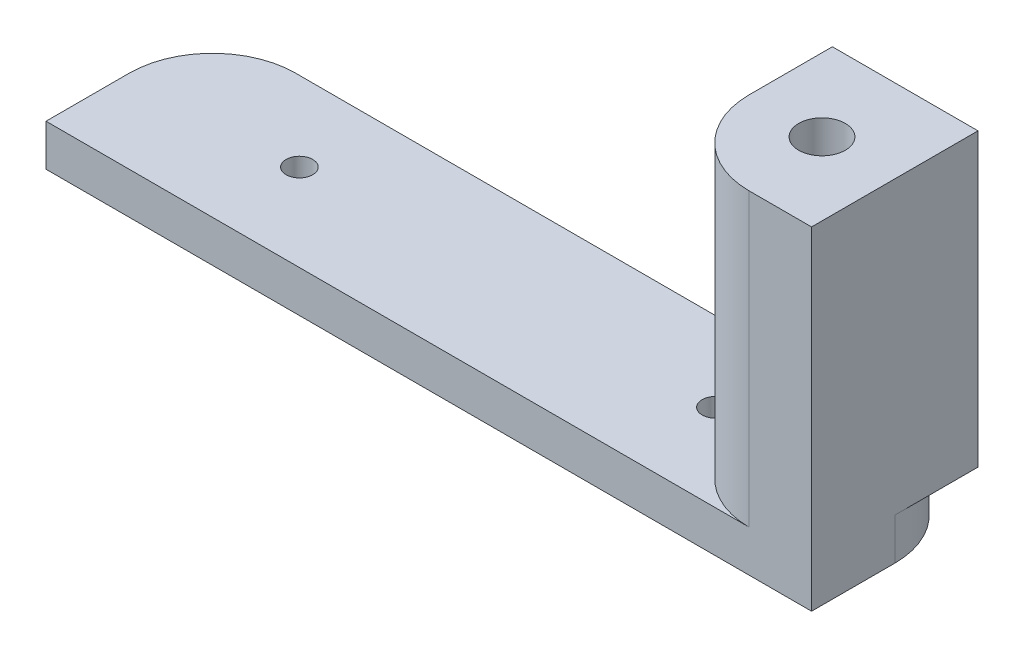
ISO-10303-21;
HEADER;
FILE_DESCRIPTION(('STEP AP214'),'2;1');
FILE_NAME('part.step','',(''),(''),'','','');
FILE_SCHEMA(('AUTOMOTIVE_DESIGN { 1 0 10303 214 1 1 1 1 }'));
ENDSEC;
DATA;
#1=APPLICATION_CONTEXT('core data for automotive mechanical design processes');
#2=APPLICATION_PROTOCOL_DEFINITION('international standard','automotive_design',2000,#1);
#3=PRODUCT_CONTEXT('',#1,'mechanical');
#4=PRODUCT('Part','Part','',(#3));
#5=PRODUCT_RELATED_PRODUCT_CATEGORY('part','',(#4));
#6=PRODUCT_DEFINITION_FORMATION('','',#4);
#7=PRODUCT_DEFINITION_CONTEXT('part definition',#1,'design');
#8=PRODUCT_DEFINITION('design','',#6,#7);
#9=PRODUCT_DEFINITION_SHAPE('','',#8);
#10=(LENGTH_UNIT() NAMED_UNIT(*) SI_UNIT(.MILLI.,.METRE.));
#11=(NAMED_UNIT(*) PLANE_ANGLE_UNIT() SI_UNIT($,.RADIAN.));
#12=(NAMED_UNIT(*) SI_UNIT($,.STERADIAN.) SOLID_ANGLE_UNIT());
#13=UNCERTAINTY_MEASURE_WITH_UNIT(LENGTH_MEASURE(1.E-05),#10,'distance_accuracy_value','');
#14=(GEOMETRIC_REPRESENTATION_CONTEXT(3) GLOBAL_UNCERTAINTY_ASSIGNED_CONTEXT((#13)) GLOBAL_UNIT_ASSIGNED_CONTEXT((#10,
#11,#12)) REPRESENTATION_CONTEXT('',''));
#15=CARTESIAN_POINT('',(0.,0.,0.));
#16=DIRECTION('',(0.,0.,1.));
#17=DIRECTION('',(1.,0.,0.));
#18=AXIS2_PLACEMENT_3D('',#15,#16,#17);
#19=CARTESIAN_POINT('',(0.,5.,0.));
#20=DIRECTION('',(0.,-1.,0.));
#21=DIRECTION('',(0.,0.,-1.));
#22=AXIS2_PLACEMENT_3D('',#19,#20,#21);
#23=PLANE('',#22);
#24=CARTESIAN_POINT('',(24.,5.,-0.449999999999999));
#25=DIRECTION('',(0.,1.,0.));
#26=DIRECTION('',(0.,0.,1.));
#27=AXIS2_PLACEMENT_3D('',#24,#25,#26);
#28=CIRCLE('',#27,1.6);
#29=CARTESIAN_POINT('',(24.,5.,1.15));
#30=VERTEX_POINT('',#29);
#31=EDGE_CURVE('E185',#30,#30,#28,.T.);
#32=ORIENTED_EDGE('',*,*,#31,.F.);
#33=EDGE_LOOP('',(#32));
#34=FACE_BOUND('',#33,.T.);
#35=CARTESIAN_POINT('',(-26.,5.,-0.449999999999999));
#36=DIRECTION('',(0.,1.,0.));
#37=DIRECTION('',(0.,0.,1.));
#38=AXIS2_PLACEMENT_3D('',#35,#36,#37);
#39=CIRCLE('',#38,1.6);
#40=CARTESIAN_POINT('',(-26.,5.,1.15));
#41=VERTEX_POINT('',#40);
#42=EDGE_CURVE('E181',#41,#41,#39,.T.);
#43=ORIENTED_EDGE('',*,*,#42,.F.);
#44=EDGE_LOOP('',(#43));
#45=FACE_BOUND('',#44,.T.);
#46=DIRECTION('',(0.,0.,1.));
#47=VECTOR('',#46,1.);
#48=CARTESIAN_POINT('',(28.5,5.,-10.));
#49=LINE('',#48,#47);
#50=CARTESIAN_POINT('',(28.5,5.,-10.));
#51=VERTEX_POINT('',#50);
#52=CARTESIAN_POINT('',(28.5,5.,0.));
#53=VERTEX_POINT('',#52);
#54=EDGE_CURVE('E159',#51,#53,#49,.T.);
#55=ORIENTED_EDGE('',*,*,#54,.F.);
#56=DIRECTION('',(-1.,0.,0.));
#57=VECTOR('',#56,1.);
#58=CARTESIAN_POINT('',(-46.,5.,-10.));
#59=LINE('',#58,#57);
#60=CARTESIAN_POINT('',(-36.,5.,-10.));
#61=VERTEX_POINT('',#60);
#62=EDGE_CURVE('E192',#51,#61,#59,.T.);
#63=ORIENTED_EDGE('',*,*,#62,.T.);
#64=CARTESIAN_POINT('',(-36.,5.,0.));
#65=DIRECTION('',(0.,-1.,0.));
#66=DIRECTION('',(0.,0.,-1.));
#67=AXIS2_PLACEMENT_3D('',#64,#65,#66);
#68=CIRCLE('',#67,10.);
#69=CARTESIAN_POINT('',(-46.,5.,0.));
#70=VERTEX_POINT('',#69);
#71=EDGE_CURVE('E230',#61,#70,#68,.F.);
#72=ORIENTED_EDGE('',*,*,#71,.T.);
#73=DIRECTION('',(0.,0.,1.));
#74=VECTOR('',#73,1.);
#75=CARTESIAN_POINT('',(-46.,5.,10.));
#76=LINE('',#75,#74);
#77=CARTESIAN_POINT('',(-46.,5.,10.));
#78=VERTEX_POINT('',#77);
#79=EDGE_CURVE('E195',#70,#78,#76,.T.);
#80=ORIENTED_EDGE('',*,*,#79,.T.);
#81=DIRECTION('',(1.,0.,0.));
#82=VECTOR('',#81,1.);
#83=CARTESIAN_POINT('',(-46.,5.,10.));
#84=LINE('',#83,#82);
#85=CARTESIAN_POINT('',(38.5,5.,10.));
#86=VERTEX_POINT('',#85);
#87=EDGE_CURVE('E145',#78,#86,#84,.T.);
#88=ORIENTED_EDGE('',*,*,#87,.T.);
#89=CARTESIAN_POINT('',(38.5,5.,0.));
#90=DIRECTION('',(0.,-1.,0.));
#91=DIRECTION('',(0.,0.,-1.));
#92=AXIS2_PLACEMENT_3D('',#89,#90,#91);
#93=CIRCLE('',#92,10.);
#94=EDGE_CURVE('E11',#86,#53,#93,.T.);
#95=ORIENTED_EDGE('',*,*,#94,.T.);
#96=EDGE_LOOP('',(#55,#63,#72,#80,#88,#95));
#97=FACE_BOUND('',#96,.T.);
#98=ADVANCED_FACE('F45',(#34,#45,#97),#23,.F.);
#99=CARTESIAN_POINT('',(46.,5.,10.));
#100=DIRECTION('',(-1.,0.,0.));
#101=DIRECTION('',(0.,0.,1.));
#102=AXIS2_PLACEMENT_3D('',#99,#100,#101);
#103=PLANE('',#102);
#104=DIRECTION('',(0.,0.,-1.));
#105=VECTOR('',#104,1.);
#106=CARTESIAN_POINT('',(46.,0.,10.));
#107=LINE('',#106,#105);
#108=CARTESIAN_POINT('',(46.,0.,10.));
#109=VERTEX_POINT('',#108);
#110=CARTESIAN_POINT('',(46.,0.,0.));
#111=VERTEX_POINT('',#110);
#112=EDGE_CURVE('E180',#109,#111,#107,.T.);
#113=ORIENTED_EDGE('',*,*,#112,.T.);
#114=DIRECTION('',(0.,-1.,0.));
#115=VECTOR('',#114,1.);
#116=CARTESIAN_POINT('',(46.,5.,0.));
#117=LINE('',#116,#115);
#118=CARTESIAN_POINT('',(46.,5.,0.));
#119=VERTEX_POINT('',#118);
#120=EDGE_CURVE('E227',#111,#119,#117,.F.);
#121=ORIENTED_EDGE('',*,*,#120,.T.);
#122=DIRECTION('',(0.,0.,-1.));
#123=VECTOR('',#122,1.);
#124=CARTESIAN_POINT('',(46.,5.,-10.));
#125=LINE('',#124,#123);
#126=CARTESIAN_POINT('',(46.,5.,-10.));
#127=VERTEX_POINT('',#126);
#128=EDGE_CURVE('E162',#119,#127,#125,.T.);
#129=ORIENTED_EDGE('',*,*,#128,.T.);
#130=DIRECTION('',(0.,-1.,0.));
#131=VECTOR('',#130,1.);
#132=CARTESIAN_POINT('',(46.,40.,-10.));
#133=LINE('',#132,#131);
#134=CARTESIAN_POINT('',(46.,40.,-10.));
#135=VERTEX_POINT('',#134);
#136=EDGE_CURVE('E149',#135,#127,#133,.T.);
#137=ORIENTED_EDGE('',*,*,#136,.F.);
#138=DIRECTION('',(0.,0.,-1.));
#139=VECTOR('',#138,1.);
#140=CARTESIAN_POINT('',(46.,40.,-10.));
#141=LINE('',#140,#139);
#142=CARTESIAN_POINT('',(46.,40.,10.));
#143=VERTEX_POINT('',#142);
#144=EDGE_CURVE('E125',#143,#135,#141,.T.);
#145=ORIENTED_EDGE('',*,*,#144,.F.);
#146=DIRECTION('',(0.,-1.,0.));
#147=VECTOR('',#146,1.);
#148=CARTESIAN_POINT('',(46.,5.,10.));
#149=LINE('',#148,#147);
#150=EDGE_CURVE('E135',#143,#109,#149,.T.);
#151=ORIENTED_EDGE('',*,*,#150,.T.);
#152=EDGE_LOOP('',(#113,#121,#129,#137,#145,#151));
#153=FACE_BOUND('',#152,.T.);
#154=ADVANCED_FACE('F147',(#153),#103,.F.);
#155=CARTESIAN_POINT('',(-46.,5.,-10.));
#156=DIRECTION('',(0.,0.,1.));
#157=DIRECTION('',(1.,0.,0.));
#158=AXIS2_PLACEMENT_3D('',#155,#156,#157);
#159=PLANE('',#158);
#160=ORIENTED_EDGE('',*,*,#62,.F.);
#161=DIRECTION('',(0.,-1.,0.));
#162=VECTOR('',#161,1.);
#163=CARTESIAN_POINT('',(28.5,40.,-10.));
#164=LINE('',#163,#162);
#165=CARTESIAN_POINT('',(28.5,40.,-10.));
#166=VERTEX_POINT('',#165);
#167=EDGE_CURVE('E155',#166,#51,#164,.T.);
#168=ORIENTED_EDGE('',*,*,#167,.F.);
#169=DIRECTION('',(-1.,0.,0.));
#170=VECTOR('',#169,1.);
#171=CARTESIAN_POINT('',(28.5,40.,-10.));
#172=LINE('',#171,#170);
#173=EDGE_CURVE('E152',#135,#166,#172,.T.);
#174=ORIENTED_EDGE('',*,*,#173,.F.);
#175=ORIENTED_EDGE('',*,*,#136,.T.);
#176=DIRECTION('',(-1.,0.,0.));
#177=VECTOR('',#176,1.);
#178=CARTESIAN_POINT('',(28.5,5.,-10.));
#179=LINE('',#178,#177);
#180=CARTESIAN_POINT('',(36.,5.,-10.));
#181=VERTEX_POINT('',#180);
#182=EDGE_CURVE('E166',#127,#181,#179,.T.);
#183=ORIENTED_EDGE('',*,*,#182,.T.);
#184=DIRECTION('',(0.,-1.,0.));
#185=VECTOR('',#184,1.);
#186=CARTESIAN_POINT('',(36.,5.,-10.));
#187=LINE('',#186,#185);
#188=CARTESIAN_POINT('',(36.,0.,-10.));
#189=VERTEX_POINT('',#188);
#190=EDGE_CURVE('E217',#181,#189,#187,.T.);
#191=ORIENTED_EDGE('',*,*,#190,.T.);
#192=DIRECTION('',(-1.,0.,0.));
#193=VECTOR('',#192,1.);
#194=CARTESIAN_POINT('',(-46.,0.,-10.));
#195=LINE('',#194,#193);
#196=CARTESIAN_POINT('',(-36.,0.,-10.));
#197=VERTEX_POINT('',#196);
#198=EDGE_CURVE('E202',#189,#197,#195,.T.);
#199=ORIENTED_EDGE('',*,*,#198,.T.);
#200=DIRECTION('',(0.,-1.,0.));
#201=VECTOR('',#200,1.);
#202=CARTESIAN_POINT('',(-36.,5.,-10.));
#203=LINE('',#202,#201);
#204=EDGE_CURVE('E213',#197,#61,#203,.F.);
#205=ORIENTED_EDGE('',*,*,#204,.T.);
#206=EDGE_LOOP('',(#160,#168,#174,#175,#183,#191,#199,#205));
#207=FACE_BOUND('',#206,.T.);
#208=ADVANCED_FACE('F263',(#207),#159,.F.);
#209=CARTESIAN_POINT('',(-46.,5.,10.));
#210=DIRECTION('',(1.,0.,0.));
#211=DIRECTION('',(0.,0.,-1.));
#212=AXIS2_PLACEMENT_3D('',#209,#210,#211);
#213=PLANE('',#212);
#214=ORIENTED_EDGE('',*,*,#79,.F.);
#215=DIRECTION('',(0.,-1.,0.));
#216=VECTOR('',#215,1.);
#217=CARTESIAN_POINT('',(-46.,5.,0.));
#218=LINE('',#217,#216);
#219=CARTESIAN_POINT('',(-46.,0.,0.));
#220=VERTEX_POINT('',#219);
#221=EDGE_CURVE('E237',#70,#220,#218,.T.);
#222=ORIENTED_EDGE('',*,*,#221,.T.);
#223=DIRECTION('',(0.,0.,1.));
#224=VECTOR('',#223,1.);
#225=CARTESIAN_POINT('',(-46.,0.,10.));
#226=LINE('',#225,#224);
#227=CARTESIAN_POINT('',(-46.,0.,10.));
#228=VERTEX_POINT('',#227);
#229=EDGE_CURVE('E206',#220,#228,#226,.T.);
#230=ORIENTED_EDGE('',*,*,#229,.T.);
#231=DIRECTION('',(0.,-1.,0.));
#232=VECTOR('',#231,1.);
#233=CARTESIAN_POINT('',(-46.,5.,10.));
#234=LINE('',#233,#232);
#235=EDGE_CURVE('E144',#78,#228,#234,.T.);
#236=ORIENTED_EDGE('',*,*,#235,.F.);
#237=EDGE_LOOP('',(#214,#222,#230,#236));
#238=FACE_BOUND('',#237,.T.);
#239=ADVANCED_FACE('F277',(#238),#213,.F.);
#240=CARTESIAN_POINT('',(-46.,5.,10.));
#241=DIRECTION('',(0.,0.,-1.));
#242=DIRECTION('',(-1.,0.,0.));
#243=AXIS2_PLACEMENT_3D('',#240,#241,#242);
#244=PLANE('',#243);
#245=DIRECTION('',(1.,0.,0.));
#246=VECTOR('',#245,1.);
#247=CARTESIAN_POINT('',(28.5,40.,10.));
#248=LINE('',#247,#246);
#249=CARTESIAN_POINT('',(38.5,40.,10.));
#250=VERTEX_POINT('',#249);
#251=EDGE_CURVE('E121',#250,#143,#248,.T.);
#252=ORIENTED_EDGE('',*,*,#251,.F.);
#253=DIRECTION('',(0.,-1.,0.));
#254=VECTOR('',#253,1.);
#255=CARTESIAN_POINT('',(38.5,5.,10.));
#256=LINE('',#255,#254);
#257=EDGE_CURVE('E241',#250,#86,#256,.T.);
#258=ORIENTED_EDGE('',*,*,#257,.T.);
#259=ORIENTED_EDGE('',*,*,#87,.F.);
#260=ORIENTED_EDGE('',*,*,#235,.T.);
#261=DIRECTION('',(1.,0.,0.));
#262=VECTOR('',#261,1.);
#263=CARTESIAN_POINT('',(-46.,0.,10.));
#264=LINE('',#263,#262);
#265=EDGE_CURVE('E139',#228,#109,#264,.T.);
#266=ORIENTED_EDGE('',*,*,#265,.T.);
#267=ORIENTED_EDGE('',*,*,#150,.F.);
#268=EDGE_LOOP('',(#252,#258,#259,#260,#266,#267));
#269=FACE_BOUND('',#268,.T.);
#270=ADVANCED_FACE('F136',(#269),#244,.F.);
#271=CARTESIAN_POINT('',(0.,0.,0.));
#272=DIRECTION('',(0.,-1.,0.));
#273=DIRECTION('',(0.,0.,-1.));
#274=AXIS2_PLACEMENT_3D('',#271,#272,#273);
#275=PLANE('',#274);
#276=CARTESIAN_POINT('',(37.25,0.,0.));
#277=DIRECTION('',(0.,-1.,0.));
#278=DIRECTION('',(0.,0.,-1.));
#279=AXIS2_PLACEMENT_3D('',#276,#277,#278);
#280=CIRCLE('',#279,2.8);
#281=CARTESIAN_POINT('',(37.25,0.,2.8));
#282=VERTEX_POINT('',#281);
#283=EDGE_CURVE('E163',#282,#282,#280,.T.);
#284=ORIENTED_EDGE('',*,*,#283,.F.);
#285=EDGE_LOOP('',(#284));
#286=FACE_BOUND('',#285,.T.);
#287=CARTESIAN_POINT('',(-26.,0.,-0.449999999999999));
#288=DIRECTION('',(0.,1.,0.));
#289=DIRECTION('',(0.,0.,1.));
#290=AXIS2_PLACEMENT_3D('',#287,#288,#289);
#291=CIRCLE('',#290,1.6);
#292=CARTESIAN_POINT('',(-26.,0.,1.15));
#293=VERTEX_POINT('',#292);
#294=EDGE_CURVE('E176',#293,#293,#291,.T.);
#295=ORIENTED_EDGE('',*,*,#294,.T.);
#296=EDGE_LOOP('',(#295));
#297=FACE_BOUND('',#296,.T.);
#298=CARTESIAN_POINT('',(24.,0.,-0.449999999999999));
#299=DIRECTION('',(0.,1.,0.));
#300=DIRECTION('',(0.,0.,1.));
#301=AXIS2_PLACEMENT_3D('',#298,#299,#300);
#302=CIRCLE('',#301,1.6);
#303=CARTESIAN_POINT('',(24.,0.,1.15));
#304=VERTEX_POINT('',#303);
#305=EDGE_CURVE('E175',#304,#304,#302,.T.);
#306=ORIENTED_EDGE('',*,*,#305,.T.);
#307=EDGE_LOOP('',(#306));
#308=FACE_BOUND('',#307,.T.);
#309=ORIENTED_EDGE('',*,*,#198,.F.);
#310=CARTESIAN_POINT('',(36.,0.,0.));
#311=DIRECTION('',(0.,-1.,0.));
#312=DIRECTION('',(0.,0.,-1.));
#313=AXIS2_PLACEMENT_3D('',#310,#311,#312);
#314=CIRCLE('',#313,10.);
#315=EDGE_CURVE('E224',#189,#111,#314,.T.);
#316=ORIENTED_EDGE('',*,*,#315,.T.);
#317=ORIENTED_EDGE('',*,*,#112,.F.);
#318=ORIENTED_EDGE('',*,*,#265,.F.);
#319=ORIENTED_EDGE('',*,*,#229,.F.);
#320=CARTESIAN_POINT('',(-36.,0.,0.));
#321=DIRECTION('',(0.,-1.,0.));
#322=DIRECTION('',(0.,0.,-1.));
#323=AXIS2_PLACEMENT_3D('',#320,#321,#322);
#324=CIRCLE('',#323,10.);
#325=EDGE_CURVE('E221',#220,#197,#324,.T.);
#326=ORIENTED_EDGE('',*,*,#325,.T.);
#327=EDGE_LOOP('',(#309,#316,#317,#318,#319,#326));
#328=FACE_BOUND('',#327,.T.);
#329=ADVANCED_FACE('F271',(#286,#297,#308,#328),#275,.T.);
#330=CARTESIAN_POINT('',(36.,5.,0.));
#331=DIRECTION('',(0.,-1.,0.));
#332=DIRECTION('',(0.,0.,-1.));
#333=AXIS2_PLACEMENT_3D('',#330,#331,#332);
#334=CYLINDRICAL_SURFACE('',#333,10.);
#335=CARTESIAN_POINT('',(36.,5.,0.));
#336=DIRECTION('',(0.,-1.,0.));
#337=DIRECTION('',(0.,0.,-1.));
#338=AXIS2_PLACEMENT_3D('',#335,#336,#337);
#339=CIRCLE('',#338,10.);
#340=EDGE_CURVE('E233',#119,#181,#339,.F.);
#341=ORIENTED_EDGE('',*,*,#340,.F.);
#342=ORIENTED_EDGE('',*,*,#120,.F.);
#343=ORIENTED_EDGE('',*,*,#315,.F.);
#344=ORIENTED_EDGE('',*,*,#190,.F.);
#345=EDGE_LOOP('',(#341,#342,#343,#344));
#346=FACE_BOUND('',#345,.T.);
#347=ADVANCED_FACE('F274',(#346),#334,.T.);
#348=CARTESIAN_POINT('',(-36.,5.,0.));
#349=DIRECTION('',(0.,-1.,0.));
#350=DIRECTION('',(0.,0.,-1.));
#351=AXIS2_PLACEMENT_3D('',#348,#349,#350);
#352=CYLINDRICAL_SURFACE('',#351,10.);
#353=ORIENTED_EDGE('',*,*,#71,.F.);
#354=ORIENTED_EDGE('',*,*,#204,.F.);
#355=ORIENTED_EDGE('',*,*,#325,.F.);
#356=ORIENTED_EDGE('',*,*,#221,.F.);
#357=EDGE_LOOP('',(#353,#354,#355,#356));
#358=FACE_BOUND('',#357,.T.);
#359=ADVANCED_FACE('F285',(#358),#352,.T.);
#360=CARTESIAN_POINT('',(24.,0.,-0.449999999999999));
#361=DIRECTION('',(0.,1.,0.));
#362=DIRECTION('',(0.,0.,1.));
#363=AXIS2_PLACEMENT_3D('',#360,#361,#362);
#364=CYLINDRICAL_SURFACE('',#363,1.6);
#365=ORIENTED_EDGE('',*,*,#305,.F.);
#366=EDGE_LOOP('',(#365));
#367=FACE_BOUND('',#366,.T.);
#368=ORIENTED_EDGE('',*,*,#31,.T.);
#369=EDGE_LOOP('',(#368));
#370=FACE_BOUND('',#369,.T.);
#371=ADVANCED_FACE('F269',(#367,#370),#364,.F.);
#372=CARTESIAN_POINT('',(-26.,0.,-0.449999999999999));
#373=DIRECTION('',(0.,1.,0.));
#374=DIRECTION('',(0.,0.,1.));
#375=AXIS2_PLACEMENT_3D('',#372,#373,#374);
#376=CYLINDRICAL_SURFACE('',#375,1.6);
#377=ORIENTED_EDGE('',*,*,#294,.F.);
#378=EDGE_LOOP('',(#377));
#379=FACE_BOUND('',#378,.T.);
#380=ORIENTED_EDGE('',*,*,#42,.T.);
#381=EDGE_LOOP('',(#380));
#382=FACE_BOUND('',#381,.T.);
#383=ADVANCED_FACE('F292',(#379,#382),#376,.F.);
#384=CARTESIAN_POINT('',(0.,5.,0.));
#385=DIRECTION('',(0.,1.,0.));
#386=DIRECTION('',(0.,0.,1.));
#387=AXIS2_PLACEMENT_3D('',#384,#385,#386);
#388=PLANE('',#387);
#389=ORIENTED_EDGE('',*,*,#128,.F.);
#390=ORIENTED_EDGE('',*,*,#340,.T.);
#391=ORIENTED_EDGE('',*,*,#182,.F.);
#392=EDGE_LOOP('',(#389,#390,#391));
#393=FACE_BOUND('',#392,.T.);
#394=ADVANCED_FACE('F308',(#393),#388,.F.);
#395=CARTESIAN_POINT('',(28.5,40.,-10.));
#396=DIRECTION('',(1.,0.,0.));
#397=DIRECTION('',(0.,0.,-1.));
#398=AXIS2_PLACEMENT_3D('',#395,#396,#397);
#399=PLANE('',#398);
#400=ORIENTED_EDGE('',*,*,#54,.T.);
#401=DIRECTION('',(0.,-1.,0.));
#402=VECTOR('',#401,1.);
#403=CARTESIAN_POINT('',(28.5,40.,0.));
#404=LINE('',#403,#402);
#405=CARTESIAN_POINT('',(28.5,40.,0.));
#406=VERTEX_POINT('',#405);
#407=EDGE_CURVE('E61',#53,#406,#404,.F.);
#408=ORIENTED_EDGE('',*,*,#407,.T.);
#409=DIRECTION('',(0.,0.,1.));
#410=VECTOR('',#409,1.);
#411=CARTESIAN_POINT('',(28.5,40.,-10.));
#412=LINE('',#411,#410);
#413=EDGE_CURVE('E132',#166,#406,#412,.T.);
#414=ORIENTED_EDGE('',*,*,#413,.F.);
#415=ORIENTED_EDGE('',*,*,#167,.T.);
#416=EDGE_LOOP('',(#400,#408,#414,#415));
#417=FACE_BOUND('',#416,.T.);
#418=ADVANCED_FACE('F321',(#417),#399,.F.);
#419=CARTESIAN_POINT('',(0.,40.,0.));
#420=DIRECTION('',(0.,1.,0.));
#421=DIRECTION('',(0.,0.,1.));
#422=AXIS2_PLACEMENT_3D('',#419,#420,#421);
#423=PLANE('',#422);
#424=CARTESIAN_POINT('',(37.25,40.,0.));
#425=DIRECTION('',(0.,1.,0.));
#426=DIRECTION('',(0.,0.,1.));
#427=AXIS2_PLACEMENT_3D('',#424,#425,#426);
#428=CIRCLE('',#427,2.8);
#429=CARTESIAN_POINT('',(37.25,40.,2.8));
#430=VERTEX_POINT('',#429);
#431=EDGE_CURVE('E315',#430,#430,#428,.T.);
#432=ORIENTED_EDGE('',*,*,#431,.F.);
#433=EDGE_LOOP('',(#432));
#434=FACE_BOUND('',#433,.T.);
#435=ORIENTED_EDGE('',*,*,#413,.T.);
#436=CARTESIAN_POINT('',(38.5,40.,0.));
#437=DIRECTION('',(0.,1.,0.));
#438=DIRECTION('',(0.,0.,1.));
#439=AXIS2_PLACEMENT_3D('',#436,#437,#438);
#440=CIRCLE('',#439,10.);
#441=EDGE_CURVE('E54',#406,#250,#440,.T.);
#442=ORIENTED_EDGE('',*,*,#441,.T.);
#443=ORIENTED_EDGE('',*,*,#251,.T.);
#444=ORIENTED_EDGE('',*,*,#144,.T.);
#445=ORIENTED_EDGE('',*,*,#173,.T.);
#446=EDGE_LOOP('',(#435,#442,#443,#444,#445));
#447=FACE_BOUND('',#446,.T.);
#448=ADVANCED_FACE('F123',(#434,#447),#423,.T.);
#449=CARTESIAN_POINT('',(37.25,-5.,0.));
#450=DIRECTION('',(0.,1.,0.));
#451=DIRECTION('',(0.,0.,1.));
#452=AXIS2_PLACEMENT_3D('',#449,#450,#451);
#453=CYLINDRICAL_SURFACE('',#452,2.8);
#454=CARTESIAN_POINT('',(37.25,0.,2.8));
#455=CARTESIAN_POINT('',(37.25,0.416666666666668,2.8));
#456=CARTESIAN_POINT('',(37.25,0.833333333333334,2.8));
#457=CARTESIAN_POINT('',(37.25,1.66666666666667,2.8));
#458=CARTESIAN_POINT('',(37.25,2.08333333333333,2.8));
#459=CARTESIAN_POINT('',(37.25,2.91666666666667,2.8));
#460=CARTESIAN_POINT('',(37.25,3.33333333333333,2.8));
#461=CARTESIAN_POINT('',(37.25,4.16666666666667,2.8));
#462=CARTESIAN_POINT('',(37.25,4.58333333333333,2.8));
#463=CARTESIAN_POINT('',(37.25,5.41666666666667,2.8));
#464=CARTESIAN_POINT('',(37.25,5.83333333333333,2.8));
#465=CARTESIAN_POINT('',(37.25,6.66666666666667,2.8));
#466=CARTESIAN_POINT('',(37.25,7.08333333333333,2.8));
#467=CARTESIAN_POINT('',(37.25,7.91666666666667,2.8));
#468=CARTESIAN_POINT('',(37.25,8.33333333333334,2.8));
#469=CARTESIAN_POINT('',(37.25,9.16666666666667,2.8));
#470=CARTESIAN_POINT('',(37.25,9.58333333333333,2.8));
#471=CARTESIAN_POINT('',(37.25,10.4166666666667,2.8));
#472=CARTESIAN_POINT('',(37.25,10.8333333333333,2.8));
#473=CARTESIAN_POINT('',(37.25,11.6666666666667,2.8));
#474=CARTESIAN_POINT('',(37.25,12.0833333333333,2.8));
#475=CARTESIAN_POINT('',(37.25,12.9166666666667,2.8));
#476=CARTESIAN_POINT('',(37.25,13.3333333333333,2.8));
#477=CARTESIAN_POINT('',(37.25,14.1666666666667,2.8));
#478=CARTESIAN_POINT('',(37.25,14.5833333333333,2.8));
#479=CARTESIAN_POINT('',(37.25,15.4166666666667,2.8));
#480=CARTESIAN_POINT('',(37.25,15.8333333333333,2.8));
#481=CARTESIAN_POINT('',(37.25,16.6666666666667,2.8));
#482=CARTESIAN_POINT('',(37.25,17.0833333333333,2.8));
#483=CARTESIAN_POINT('',(37.25,17.9166666666667,2.8));
#484=CARTESIAN_POINT('',(37.25,18.3333333333333,2.8));
#485=CARTESIAN_POINT('',(37.25,19.1666666666667,2.8));
#486=CARTESIAN_POINT('',(37.25,19.5833333333333,2.8));
#487=CARTESIAN_POINT('',(37.25,20.4166666666667,2.8));
#488=CARTESIAN_POINT('',(37.25,20.8333333333333,2.8));
#489=CARTESIAN_POINT('',(37.25,21.6666666666667,2.8));
#490=CARTESIAN_POINT('',(37.25,22.0833333333333,2.8));
#491=CARTESIAN_POINT('',(37.25,22.9166666666667,2.8));
#492=CARTESIAN_POINT('',(37.25,23.3333333333333,2.8));
#493=CARTESIAN_POINT('',(37.25,24.1666666666667,2.8));
#494=CARTESIAN_POINT('',(37.25,24.5833333333333,2.8));
#495=CARTESIAN_POINT('',(37.25,25.4166666666667,2.8));
#496=CARTESIAN_POINT('',(37.25,25.8333333333333,2.8));
#497=CARTESIAN_POINT('',(37.25,26.6666666666667,2.8));
#498=CARTESIAN_POINT('',(37.25,27.0833333333333,2.8));
#499=CARTESIAN_POINT('',(37.25,27.9166666666667,2.8));
#500=CARTESIAN_POINT('',(37.25,28.3333333333333,2.8));
#501=CARTESIAN_POINT('',(37.25,29.1666666666667,2.8));
#502=CARTESIAN_POINT('',(37.25,29.5833333333333,2.8));
#503=CARTESIAN_POINT('',(37.25,30.4166666666667,2.8));
#504=CARTESIAN_POINT('',(37.25,30.8333333333333,2.8));
#505=CARTESIAN_POINT('',(37.25,31.6666666666667,2.8));
#506=CARTESIAN_POINT('',(37.25,32.0833333333333,2.8));
#507=CARTESIAN_POINT('',(37.25,32.9166666666667,2.8));
#508=CARTESIAN_POINT('',(37.25,33.3333333333333,2.8));
#509=CARTESIAN_POINT('',(37.25,34.1666666666667,2.8));
#510=CARTESIAN_POINT('',(37.25,34.5833333333333,2.8));
#511=CARTESIAN_POINT('',(37.25,35.4166666666667,2.8));
#512=CARTESIAN_POINT('',(37.25,35.8333333333333,2.8));
#513=CARTESIAN_POINT('',(37.25,36.6666666666667,2.8));
#514=CARTESIAN_POINT('',(37.25,37.0833333333333,2.8));
#515=CARTESIAN_POINT('',(37.25,37.9166666666667,2.8));
#516=CARTESIAN_POINT('',(37.25,38.3333333333333,2.8));
#517=CARTESIAN_POINT('',(37.25,39.1666666666667,2.8));
#518=CARTESIAN_POINT('',(37.25,39.5833333333333,2.8));
#519=CARTESIAN_POINT('',(37.25,40.,2.8));
#520=B_SPLINE_CURVE_WITH_KNOTS('',3,(#454,#455,#456,#457,#458,#459,#460,#461,#462,#463,#464,
#465,#466,#467,#468,#469,#470,#471,#472,#473,#474,#475,#476,#477,#478,#479,#480,#481,#482,#483,
#484,#485,#486,#487,#488,#489,#490,#491,#492,#493,#494,#495,#496,#497,#498,#499,#500,#501,#502,
#503,#504,#505,#506,#507,#508,#509,#510,#511,#512,#513,#514,#515,#516,#517,#518,#519),
.UNSPECIFIED.,.F.,.F.,(4,2,2,2,2,2,2,2,2,2,2,2,2,2,2,2,2,2,2,2,2,2,2,2,2,2,2,2,2,2,2,2,4),(0.,
1.25,2.5,3.75,5.,6.25,7.5,8.75,10.,11.25,12.5,13.75,15.,16.25,17.5,18.75,20.,21.25,22.5,23.75,
25.,26.25,27.5,28.75,30.,31.25,32.5,33.75,35.,36.25,37.5,38.75,40.),.UNSPECIFIED.);
#521=EDGE_CURVE('BSEAM249',#282,#430,#520,.T.);
#522=ORIENTED_EDGE('',*,*,#283,.T.);
#523=ORIENTED_EDGE('',*,*,#431,.T.);
#524=ORIENTED_EDGE('',*,*,#521,.T.);
#525=ORIENTED_EDGE('',*,*,#521,.F.);
#526=EDGE_LOOP('',(#522,#524,#523,#525));
#527=FACE_BOUND('',#526,.T.);
#528=ADVANCED_FACE('F249',(#527),#453,.F.);
#529=CARTESIAN_POINT('',(38.5,5.,0.));
#530=DIRECTION('',(0.,-1.,0.));
#531=DIRECTION('',(0.,0.,-1.));
#532=AXIS2_PLACEMENT_3D('',#529,#530,#531);
#533=CYLINDRICAL_SURFACE('',#532,10.);
#534=ORIENTED_EDGE('',*,*,#441,.F.);
#535=ORIENTED_EDGE('',*,*,#407,.F.);
#536=ORIENTED_EDGE('',*,*,#94,.F.);
#537=ORIENTED_EDGE('',*,*,#257,.F.);
#538=EDGE_LOOP('',(#534,#535,#536,#537));
#539=FACE_BOUND('',#538,.T.);
#540=ADVANCED_FACE('F47',(#539),#533,.T.);
#541=CLOSED_SHELL('',(#98,#154,#208,#239,#270,#329,#347,#359,#371,#383,#394,#418,#448,#528,#540));
#542=MANIFOLD_SOLID_BREP('B2',#541);
#543=ADVANCED_BREP_SHAPE_REPRESENTATION('',(#18,#542),#14);
#544=SHAPE_DEFINITION_REPRESENTATION(#9,#543);
ENDSEC;
END-ISO-10303-21;
